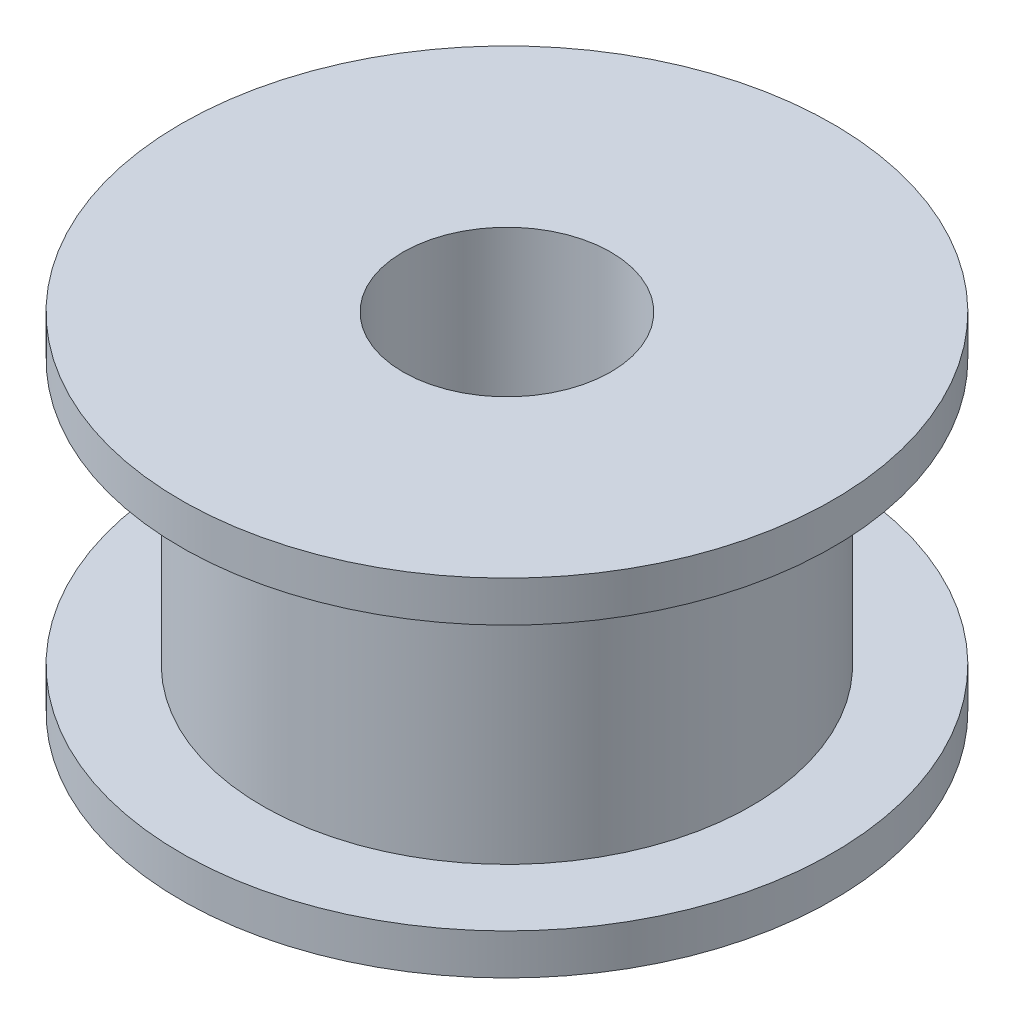
ISO-10303-21;
HEADER;
FILE_DESCRIPTION(('STEP AP214'),'2;1');
FILE_NAME('part.step','',(''),(''),'','','');
FILE_SCHEMA(('AUTOMOTIVE_DESIGN { 1 0 10303 214 1 1 1 1 }'));
ENDSEC;
DATA;
#1=APPLICATION_CONTEXT('core data for automotive mechanical design processes');
#2=APPLICATION_PROTOCOL_DEFINITION('international standard','automotive_design',2000,#1);
#3=PRODUCT_CONTEXT('',#1,'mechanical');
#4=PRODUCT('Part','Part','',(#3));
#5=PRODUCT_RELATED_PRODUCT_CATEGORY('part','',(#4));
#6=PRODUCT_DEFINITION_FORMATION('','',#4);
#7=PRODUCT_DEFINITION_CONTEXT('part definition',#1,'design');
#8=PRODUCT_DEFINITION('design','',#6,#7);
#9=PRODUCT_DEFINITION_SHAPE('','',#8);
#10=(LENGTH_UNIT() NAMED_UNIT(*) SI_UNIT(.MILLI.,.METRE.));
#11=(NAMED_UNIT(*) PLANE_ANGLE_UNIT() SI_UNIT($,.RADIAN.));
#12=(NAMED_UNIT(*) SI_UNIT($,.STERADIAN.) SOLID_ANGLE_UNIT());
#13=UNCERTAINTY_MEASURE_WITH_UNIT(LENGTH_MEASURE(1.E-05),#10,'distance_accuracy_value','');
#14=(GEOMETRIC_REPRESENTATION_CONTEXT(3) GLOBAL_UNCERTAINTY_ASSIGNED_CONTEXT((#13)) GLOBAL_UNIT_ASSIGNED_CONTEXT((#10,
#11,#12)) REPRESENTATION_CONTEXT('',''));
#15=CARTESIAN_POINT('',(0.,0.,0.));
#16=DIRECTION('',(0.,0.,1.));
#17=DIRECTION('',(1.,0.,0.));
#18=AXIS2_PLACEMENT_3D('',#15,#16,#17);
#19=CARTESIAN_POINT('',(0.,0.,0.));
#20=DIRECTION('',(0.,-1.,0.));
#21=DIRECTION('',(1.,0.,0.));
#22=AXIS2_PLACEMENT_3D('',#19,#20,#21);
#23=PLANE('',#22);
#24=CARTESIAN_POINT('',(0.,0.,0.));
#25=DIRECTION('',(0.,1.,0.));
#26=DIRECTION('',(-1.,0.,0.));
#27=AXIS2_PLACEMENT_3D('',#24,#25,#26);
#28=CIRCLE('',#27,2.55);
#29=CARTESIAN_POINT('',(-2.55,0.,0.));
#30=VERTEX_POINT('',#29);
#31=EDGE_CURVE('E56',#30,#30,#28,.T.);
#32=ORIENTED_EDGE('',*,*,#31,.T.);
#33=EDGE_LOOP('',(#32));
#34=FACE_BOUND('',#33,.T.);
#35=CARTESIAN_POINT('',(0.,0.,0.));
#36=DIRECTION('',(0.,1.,0.));
#37=DIRECTION('',(-1.,0.,0.));
#38=AXIS2_PLACEMENT_3D('',#35,#36,#37);
#39=CIRCLE('',#38,8.);
#40=CARTESIAN_POINT('',(-8.,0.,0.));
#41=VERTEX_POINT('',#40);
#42=EDGE_CURVE('E10',#41,#41,#39,.T.);
#43=ORIENTED_EDGE('',*,*,#42,.F.);
#44=EDGE_LOOP('',(#43));
#45=FACE_BOUND('',#44,.T.);
#46=ADVANCED_FACE('F31',(#34,#45),#23,.T.);
#47=CARTESIAN_POINT('',(0.,8.5,0.));
#48=DIRECTION('',(0.,1.,0.));
#49=DIRECTION('',(-1.,0.,0.));
#50=AXIS2_PLACEMENT_3D('',#47,#48,#49);
#51=CYLINDRICAL_SURFACE('',#50,8.);
#52=ORIENTED_EDGE('',*,*,#42,.T.);
#53=EDGE_LOOP('',(#52));
#54=FACE_BOUND('',#53,.T.);
#55=CARTESIAN_POINT('',(0.,0.999999999999997,0.));
#56=DIRECTION('',(0.,1.,0.));
#57=DIRECTION('',(-1.,0.,0.));
#58=AXIS2_PLACEMENT_3D('',#55,#56,#57);
#59=CIRCLE('',#58,8.);
#60=CARTESIAN_POINT('',(-8.,0.999999999999999,0.));
#61=VERTEX_POINT('',#60);
#62=EDGE_CURVE('E37',#61,#61,#59,.T.);
#63=ORIENTED_EDGE('',*,*,#62,.F.);
#64=EDGE_LOOP('',(#63));
#65=FACE_BOUND('',#64,.T.);
#66=ADVANCED_FACE('F89',(#54,#65),#51,.T.);
#67=CARTESIAN_POINT('',(-8.,0.999999999999999,0.));
#68=DIRECTION('',(0.,1.,0.));
#69=DIRECTION('',(-1.,0.,0.));
#70=AXIS2_PLACEMENT_3D('',#67,#68,#69);
#71=PLANE('',#70);
#72=ORIENTED_EDGE('',*,*,#62,.T.);
#73=EDGE_LOOP('',(#72));
#74=FACE_BOUND('',#73,.T.);
#75=CARTESIAN_POINT('',(0.,0.999999999999997,0.));
#76=DIRECTION('',(0.,1.,0.));
#77=DIRECTION('',(-1.,0.,0.));
#78=AXIS2_PLACEMENT_3D('',#75,#76,#77);
#79=CIRCLE('',#78,6.);
#80=CARTESIAN_POINT('',(-6.,0.999999999999999,0.));
#81=VERTEX_POINT('',#80);
#82=EDGE_CURVE('E41',#81,#81,#79,.T.);
#83=ORIENTED_EDGE('',*,*,#82,.F.);
#84=EDGE_LOOP('',(#83));
#85=FACE_BOUND('',#84,.T.);
#86=ADVANCED_FACE('F93',(#74,#85),#71,.T.);
#87=CARTESIAN_POINT('',(0.,8.5,0.));
#88=DIRECTION('',(0.,1.,0.));
#89=DIRECTION('',(-1.,0.,0.));
#90=AXIS2_PLACEMENT_3D('',#87,#88,#89);
#91=CYLINDRICAL_SURFACE('',#90,6.);
#92=ORIENTED_EDGE('',*,*,#82,.T.);
#93=EDGE_LOOP('',(#92));
#94=FACE_BOUND('',#93,.T.);
#95=CARTESIAN_POINT('',(0.,7.5,0.));
#96=DIRECTION('',(0.,1.,0.));
#97=DIRECTION('',(-1.,0.,0.));
#98=AXIS2_PLACEMENT_3D('',#95,#96,#97);
#99=CIRCLE('',#98,6.);
#100=CARTESIAN_POINT('',(-6.,7.5,0.));
#101=VERTEX_POINT('',#100);
#102=EDGE_CURVE('E45',#101,#101,#99,.T.);
#103=ORIENTED_EDGE('',*,*,#102,.F.);
#104=EDGE_LOOP('',(#103));
#105=FACE_BOUND('',#104,.T.);
#106=ADVANCED_FACE('F85',(#94,#105),#91,.T.);
#107=CARTESIAN_POINT('',(-6.,7.5,0.));
#108=DIRECTION('',(0.,-1.,0.));
#109=DIRECTION('',(1.,0.,0.));
#110=AXIS2_PLACEMENT_3D('',#107,#108,#109);
#111=PLANE('',#110);
#112=ORIENTED_EDGE('',*,*,#102,.T.);
#113=EDGE_LOOP('',(#112));
#114=FACE_BOUND('',#113,.T.);
#115=CARTESIAN_POINT('',(0.,7.5,0.));
#116=DIRECTION('',(0.,1.,0.));
#117=DIRECTION('',(-1.,0.,0.));
#118=AXIS2_PLACEMENT_3D('',#115,#116,#117);
#119=CIRCLE('',#118,8.00000000000001);
#120=CARTESIAN_POINT('',(-8.,7.5,0.));
#121=VERTEX_POINT('',#120);
#122=EDGE_CURVE('E50',#121,#121,#119,.T.);
#123=ORIENTED_EDGE('',*,*,#122,.F.);
#124=EDGE_LOOP('',(#123));
#125=FACE_BOUND('',#124,.T.);
#126=ADVANCED_FACE('F79',(#114,#125),#111,.T.);
#127=CARTESIAN_POINT('',(0.,8.5,0.));
#128=DIRECTION('',(0.,1.,0.));
#129=DIRECTION('',(-1.,0.,0.));
#130=AXIS2_PLACEMENT_3D('',#127,#128,#129);
#131=CYLINDRICAL_SURFACE('',#130,8.);
#132=ORIENTED_EDGE('',*,*,#122,.T.);
#133=EDGE_LOOP('',(#132));
#134=FACE_BOUND('',#133,.T.);
#135=CARTESIAN_POINT('',(0.,8.5,0.));
#136=DIRECTION('',(0.,1.,0.));
#137=DIRECTION('',(-1.,0.,0.));
#138=AXIS2_PLACEMENT_3D('',#135,#136,#137);
#139=CIRCLE('',#138,8.);
#140=CARTESIAN_POINT('',(-8.,8.5,0.));
#141=VERTEX_POINT('',#140);
#142=EDGE_CURVE('E53',#141,#141,#139,.T.);
#143=ORIENTED_EDGE('',*,*,#142,.F.);
#144=EDGE_LOOP('',(#143));
#145=FACE_BOUND('',#144,.T.);
#146=ADVANCED_FACE('F74',(#134,#145),#131,.T.);
#147=CARTESIAN_POINT('',(-8.,8.5,0.));
#148=DIRECTION('',(0.,1.,0.));
#149=DIRECTION('',(-1.,0.,0.));
#150=AXIS2_PLACEMENT_3D('',#147,#148,#149);
#151=PLANE('',#150);
#152=CARTESIAN_POINT('',(0.,8.5,0.));
#153=DIRECTION('',(0.,1.,0.));
#154=DIRECTION('',(-1.,0.,0.));
#155=AXIS2_PLACEMENT_3D('',#152,#153,#154);
#156=CIRCLE('',#155,2.55);
#157=CARTESIAN_POINT('',(-2.55,8.5,0.));
#158=VERTEX_POINT('',#157);
#159=EDGE_CURVE('E57',#158,#158,#156,.T.);
#160=ORIENTED_EDGE('',*,*,#159,.F.);
#161=EDGE_LOOP('',(#160));
#162=FACE_BOUND('',#161,.T.);
#163=ORIENTED_EDGE('',*,*,#142,.T.);
#164=EDGE_LOOP('',(#163));
#165=FACE_BOUND('',#164,.T.);
#166=ADVANCED_FACE('F68',(#162,#165),#151,.T.);
#167=CARTESIAN_POINT('',(0.,0.,0.));
#168=DIRECTION('',(0.,1.,0.));
#169=DIRECTION('',(-1.,0.,0.));
#170=AXIS2_PLACEMENT_3D('',#167,#168,#169);
#171=CYLINDRICAL_SURFACE('',#170,2.55);
#172=ORIENTED_EDGE('',*,*,#31,.F.);
#173=EDGE_LOOP('',(#172));
#174=FACE_BOUND('',#173,.T.);
#175=ORIENTED_EDGE('',*,*,#159,.T.);
#176=EDGE_LOOP('',(#175));
#177=FACE_BOUND('',#176,.T.);
#178=ADVANCED_FACE('F65',(#174,#177),#171,.F.);
#179=CLOSED_SHELL('',(#46,#66,#86,#106,#126,#146,#166,#178));
#180=MANIFOLD_SOLID_BREP('B2',#179);
#181=ADVANCED_BREP_SHAPE_REPRESENTATION('',(#18,#180),#14);
#182=SHAPE_DEFINITION_REPRESENTATION(#9,#181);
ENDSEC;
END-ISO-10303-21;
